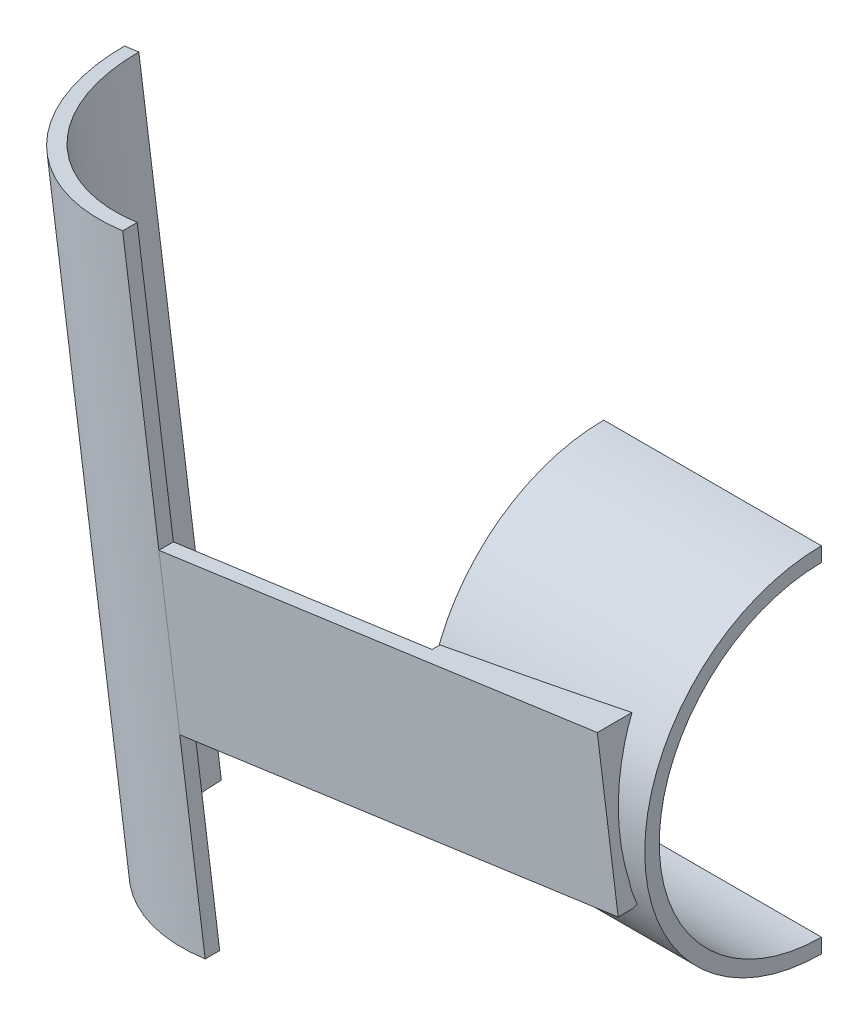
ISO-10303-21;
HEADER;
FILE_DESCRIPTION(('STEP AP214'),'2;1');
FILE_NAME('part.step','',(''),(''),'','','');
FILE_SCHEMA(('AUTOMOTIVE_DESIGN { 1 0 10303 214 1 1 1 1 }'));
ENDSEC;
DATA;
#1=APPLICATION_CONTEXT('core data for automotive mechanical design processes');
#2=APPLICATION_PROTOCOL_DEFINITION('international standard','automotive_design',2000,#1);
#3=PRODUCT_CONTEXT('',#1,'mechanical');
#4=PRODUCT('Part','Part','',(#3));
#5=PRODUCT_RELATED_PRODUCT_CATEGORY('part','',(#4));
#6=PRODUCT_DEFINITION_FORMATION('','',#4);
#7=PRODUCT_DEFINITION_CONTEXT('part definition',#1,'design');
#8=PRODUCT_DEFINITION('design','',#6,#7);
#9=PRODUCT_DEFINITION_SHAPE('','',#8);
#10=(LENGTH_UNIT() NAMED_UNIT(*) SI_UNIT(.MILLI.,.METRE.));
#11=(NAMED_UNIT(*) PLANE_ANGLE_UNIT() SI_UNIT($,.RADIAN.));
#12=(NAMED_UNIT(*) SI_UNIT($,.STERADIAN.) SOLID_ANGLE_UNIT());
#13=UNCERTAINTY_MEASURE_WITH_UNIT(LENGTH_MEASURE(1.E-05),#10,'distance_accuracy_value','');
#14=(GEOMETRIC_REPRESENTATION_CONTEXT(3) GLOBAL_UNCERTAINTY_ASSIGNED_CONTEXT((#13)) GLOBAL_UNIT_ASSIGNED_CONTEXT((#10,
#11,#12)) REPRESENTATION_CONTEXT('',''));
#15=CARTESIAN_POINT('',(0.,0.,0.));
#16=DIRECTION('',(0.,0.,1.));
#17=DIRECTION('',(1.,0.,0.));
#18=AXIS2_PLACEMENT_3D('',#15,#16,#17);
#19=CARTESIAN_POINT('',(485.481917252767,857.898759870621,0.));
#20=DIRECTION('',(-1.,0.,0.));
#21=DIRECTION('',(0.,0.,1.));
#22=AXIS2_PLACEMENT_3D('',#19,#20,#21);
#23=CYLINDRICAL_SURFACE('',#22,24.35);
#24=CARTESIAN_POINT('',(456.832927260746,857.898759870621,0.));
#25=DIRECTION('',(0.990343871933616,0.138632663263508,0.));
#26=DIRECTION('',(-0.138632663263508,0.990343871933616,0.));
#27=AXIS2_PLACEMENT_3D('',#24,#25,#26);
#28=ELLIPSE('',#27,24.5874192692861,24.35);
#29=CARTESIAN_POINT('',(455.585980190012,866.80651913209,22.662178292029));
#30=VERTEX_POINT('',#29);
#31=CARTESIAN_POINT('',(456.080910168967,863.270910278046,23.7500000000001));
#32=VERTEX_POINT('',#31);
#33=EDGE_CURVE('E186',#30,#32,#28,.T.);
#34=ORIENTED_EDGE('',*,*,#33,.F.);
#35=CARTESIAN_POINT('',(391.952024168503,857.898759870621,0.));
#36=DIRECTION('',(-0.138632663263508,0.990343871933616,0.));
#37=DIRECTION('',(-0.990343871933616,-0.138632663263508,0.));
#38=AXIS2_PLACEMENT_3D('',#35,#36,#37);
#39=ELLIPSE('',#38,175.644032414759,24.35);
#40=CARTESIAN_POINT('',(480.344576988352,870.272335713678,20.9718172997984));
#41=VERTEX_POINT('',#40);
#42=EDGE_CURVE('E205',#30,#41,#39,.T.);
#43=ORIENTED_EDGE('',*,*,#42,.T.);
#44=CARTESIAN_POINT('',(482.076684210732,857.898759870621,0.));
#45=DIRECTION('',(-0.990343871933616,-0.138632663263508,0.));
#46=DIRECTION('',(-0.138632663263508,0.990343871933616,0.));
#47=AXIS2_PLACEMENT_3D('',#44,#45,#46);
#48=ELLIPSE('',#47,24.5874192692861,24.35);
#49=CARTESIAN_POINT('',(482.828701302511,852.526609463196,23.7500000000001));
#50=VERTEX_POINT('',#49);
#51=EDGE_CURVE('E346',#50,#41,#48,.T.);
#52=ORIENTED_EDGE('',*,*,#51,.F.);
#53=DIRECTION('',(-1.,0.,0.));
#54=VECTOR('',#53,1.);
#55=CARTESIAN_POINT('',(485.481917252767,852.526609463196,23.7500000000001));
#56=LINE('',#55,#54);
#57=CARTESIAN_POINT('',(455.481917252767,852.526609463196,23.7500000000001));
#58=VERTEX_POINT('',#57);
#59=EDGE_CURVE('E53',#58,#50,#56,.F.);
#60=ORIENTED_EDGE('',*,*,#59,.F.);
#61=CARTESIAN_POINT('',(455.481917252767,857.898759870621,0.));
#62=DIRECTION('',(1.,0.,0.));
#63=DIRECTION('',(0.,0.,-1.));
#64=AXIS2_PLACEMENT_3D('',#61,#62,#63);
#65=CIRCLE('',#64,24.35);
#66=CARTESIAN_POINT('',(455.481917252767,833.548759870621,0.));
#67=VERTEX_POINT('',#66);
#68=EDGE_CURVE('E328',#58,#67,#65,.T.);
#69=ORIENTED_EDGE('',*,*,#68,.T.);
#70=DIRECTION('',(-1.,0.,0.));
#71=VECTOR('',#70,1.);
#72=CARTESIAN_POINT('',(485.481917252767,833.548759870621,0.));
#73=LINE('',#72,#71);
#74=CARTESIAN_POINT('',(485.481917252767,833.548759870621,0.));
#75=VERTEX_POINT('',#74);
#76=EDGE_CURVE('E314',#67,#75,#73,.F.);
#77=ORIENTED_EDGE('',*,*,#76,.T.);
#78=CARTESIAN_POINT('',(485.481917252767,857.898759870621,0.));
#79=DIRECTION('',(1.,0.,0.));
#80=DIRECTION('',(0.,0.,-1.));
#81=AXIS2_PLACEMENT_3D('',#78,#79,#80);
#82=CIRCLE('',#81,24.35);
#83=CARTESIAN_POINT('',(485.481917252767,882.248759870621,0.));
#84=VERTEX_POINT('',#83);
#85=EDGE_CURVE('E332',#84,#75,#82,.T.);
#86=ORIENTED_EDGE('',*,*,#85,.F.);
#87=DIRECTION('',(-1.,0.,0.));
#88=VECTOR('',#87,1.);
#89=CARTESIAN_POINT('',(485.481917252767,882.248759870621,0.));
#90=LINE('',#89,#88);
#91=CARTESIAN_POINT('',(455.481917252767,882.248759870621,0.));
#92=VERTEX_POINT('',#91);
#93=EDGE_CURVE('E319',#84,#92,#90,.T.);
#94=ORIENTED_EDGE('',*,*,#93,.T.);
#95=CARTESIAN_POINT('',(455.481917252767,863.270910278046,23.7500000000001));
#96=VERTEX_POINT('',#95);
#97=EDGE_CURVE('E337',#92,#96,#65,.T.);
#98=ORIENTED_EDGE('',*,*,#97,.T.);
#99=DIRECTION('',(-1.,0.,0.));
#100=VECTOR('',#99,1.);
#101=CARTESIAN_POINT('',(485.481917252767,863.270910278046,23.7500000000001));
#102=LINE('',#101,#100);
#103=EDGE_CURVE('E11',#32,#96,#102,.T.);
#104=ORIENTED_EDGE('',*,*,#103,.F.);
#105=EDGE_LOOP('',(#34,#43,#52,#60,#69,#77,#86,#94,#98,#104));
#106=FACE_BOUND('',#105,.T.);
#107=ADVANCED_FACE('F45',(#106),#23,.T.);
#108=CARTESIAN_POINT('',(480.344576988352,870.272335713678,23.7500000000001));
#109=DIRECTION('',(0.,0.,1.));
#110=DIRECTION('',(1.,0.,0.));
#111=AXIS2_PLACEMENT_3D('',#108,#109,#110);
#112=PLANE('',#111);
#113=DIRECTION('',(-0.138632663263508,0.990343871933616,0.));
#114=VECTOR('',#113,1.);
#115=CARTESIAN_POINT('',(480.344576988352,870.272335713678,23.7500000000001));
#116=LINE('',#115,#114);
#117=CARTESIAN_POINT('',(482.879640191024,852.162719634542,23.7500000000001));
#118=VERTEX_POINT('',#117);
#119=EDGE_CURVE('E65',#118,#50,#116,.T.);
#120=ORIENTED_EDGE('',*,*,#119,.F.);
#121=DIRECTION('',(0.990343871933616,0.138632663263508,0.));
#122=VECTOR('',#121,1.);
#123=CARTESIAN_POINT('',(458.121043392683,848.696903052954,23.7500000000001));
#124=LINE('',#123,#122);
#125=CARTESIAN_POINT('',(458.121043392683,848.696903052954,23.7500000000001));
#126=VERTEX_POINT('',#125);
#127=EDGE_CURVE('E60',#118,#126,#124,.F.);
#128=ORIENTED_EDGE('',*,*,#127,.T.);
#129=DIRECTION('',(-0.138632663263508,0.990343871933616,0.));
#130=VECTOR('',#129,1.);
#131=CARTESIAN_POINT('',(455.585980190012,866.80651913209,23.7500000000001));
#132=LINE('',#131,#130);
#133=CARTESIAN_POINT('',(458.466105689158,846.231897168306,23.7500000000001));
#134=VERTEX_POINT('',#133);
#135=EDGE_CURVE('E178',#134,#126,#132,.T.);
#136=ORIENTED_EDGE('',*,*,#135,.F.);
#137=DIRECTION('',(-0.990343871933616,-0.138632663263512,0.));
#138=VECTOR('',#137,1.);
#139=CARTESIAN_POINT('',(483.224702487498,849.697713749893,23.7500000000001));
#140=LINE('',#139,#138);
#141=CARTESIAN_POINT('',(422.813726299548,841.241121290819,23.7500000000001));
#142=VERTEX_POINT('',#141);
#143=EDGE_CURVE('E165',#134,#142,#140,.T.);
#144=ORIENTED_EDGE('',*,*,#143,.T.);
#145=DIRECTION('',(-0.138632663263508,0.990343871933616,0.));
#146=VECTOR('',#145,1.);
#147=CARTESIAN_POINT('',(419.933600800401,861.815743254604,23.7500000000001));
#148=LINE('',#147,#146);
#149=CARTESIAN_POINT('',(419.933600800401,861.815743254604,23.7500000000001));
#150=VERTEX_POINT('',#149);
#151=EDGE_CURVE('E271',#142,#150,#148,.T.);
#152=ORIENTED_EDGE('',*,*,#151,.T.);
#153=DIRECTION('',(-0.990343871933616,-0.138632663263512,0.));
#154=VECTOR('',#153,1.);
#155=CARTESIAN_POINT('',(480.344576988352,870.272335713678,23.7500000000001));
#156=LINE('',#155,#154);
#157=CARTESIAN_POINT('',(455.585980190012,866.80651913209,23.7500000000001));
#158=VERTEX_POINT('',#157);
#159=EDGE_CURVE('E299',#158,#150,#156,.T.);
#160=ORIENTED_EDGE('',*,*,#159,.F.);
#161=EDGE_CURVE('E188',#32,#158,#132,.T.);
#162=ORIENTED_EDGE('',*,*,#161,.F.);
#163=ORIENTED_EDGE('',*,*,#103,.T.);
#164=DIRECTION('',(0.,-1.,0.));
#165=VECTOR('',#164,1.);
#166=CARTESIAN_POINT('',(455.481917252767,857.898759870621,23.7500000000001));
#167=LINE('',#166,#165);
#168=EDGE_CURVE('E302',#96,#58,#167,.T.);
#169=ORIENTED_EDGE('',*,*,#168,.T.);
#170=ORIENTED_EDGE('',*,*,#59,.T.);
#171=EDGE_LOOP('',(#120,#128,#136,#144,#152,#160,#162,#163,#169,#170));
#172=FACE_BOUND('',#171,.T.);
#173=ADVANCED_FACE('F179',(#172),#112,.F.);
#174=CARTESIAN_POINT('',(455.481917252767,857.898759870621,0.));
#175=DIRECTION('',(1.,0.,0.));
#176=DIRECTION('',(0.,0.,-1.));
#177=AXIS2_PLACEMENT_3D('',#174,#175,#176);
#178=PLANE('',#177);
#179=ORIENTED_EDGE('',*,*,#168,.F.);
#180=ORIENTED_EDGE('',*,*,#97,.F.);
#181=DIRECTION('',(0.,-1.,0.));
#182=VECTOR('',#181,1.);
#183=CARTESIAN_POINT('',(455.481917252767,857.898759870621,0.));
#184=LINE('',#183,#182);
#185=CARTESIAN_POINT('',(455.481917252767,880.248759870621,0.));
#186=VERTEX_POINT('',#185);
#187=EDGE_CURVE('E311',#92,#186,#184,.T.);
#188=ORIENTED_EDGE('',*,*,#187,.T.);
#189=CARTESIAN_POINT('',(455.481917252767,857.898759870621,0.));
#190=DIRECTION('',(1.,0.,0.));
#191=DIRECTION('',(0.,0.,-1.));
#192=AXIS2_PLACEMENT_3D('',#189,#190,#191);
#193=CIRCLE('',#192,22.35);
#194=CARTESIAN_POINT('',(455.481917252767,835.548759870621,0.));
#195=VERTEX_POINT('',#194);
#196=EDGE_CURVE('E323',#186,#195,#193,.T.);
#197=ORIENTED_EDGE('',*,*,#196,.T.);
#198=EDGE_CURVE('E306',#195,#67,#184,.T.);
#199=ORIENTED_EDGE('',*,*,#198,.T.);
#200=ORIENTED_EDGE('',*,*,#68,.F.);
#201=EDGE_LOOP('',(#179,#180,#188,#197,#199,#200));
#202=FACE_BOUND('',#201,.T.);
#203=ADVANCED_FACE('F356',(#202),#178,.F.);
#204=CARTESIAN_POINT('',(485.481917252767,857.898759870621,0.));
#205=DIRECTION('',(1.,0.,0.));
#206=DIRECTION('',(0.,0.,-1.));
#207=AXIS2_PLACEMENT_3D('',#204,#205,#206);
#208=PLANE('',#207);
#209=DIRECTION('',(0.,-1.,0.));
#210=VECTOR('',#209,1.);
#211=CARTESIAN_POINT('',(485.481917252767,857.898759870621,0.));
#212=LINE('',#211,#210);
#213=CARTESIAN_POINT('',(485.481917252767,880.248759870621,0.));
#214=VERTEX_POINT('',#213);
#215=EDGE_CURVE('E315',#84,#214,#212,.T.);
#216=ORIENTED_EDGE('',*,*,#215,.F.);
#217=ORIENTED_EDGE('',*,*,#85,.T.);
#218=CARTESIAN_POINT('',(485.481917252767,835.548759870621,0.));
#219=VERTEX_POINT('',#218);
#220=EDGE_CURVE('E310',#219,#75,#212,.T.);
#221=ORIENTED_EDGE('',*,*,#220,.F.);
#222=CARTESIAN_POINT('',(485.481917252767,857.898759870621,0.));
#223=DIRECTION('',(1.,0.,0.));
#224=DIRECTION('',(0.,0.,-1.));
#225=AXIS2_PLACEMENT_3D('',#222,#223,#224);
#226=CIRCLE('',#225,22.35);
#227=EDGE_CURVE('E324',#214,#219,#226,.T.);
#228=ORIENTED_EDGE('',*,*,#227,.F.);
#229=EDGE_LOOP('',(#216,#217,#221,#228));
#230=FACE_BOUND('',#229,.T.);
#231=ADVANCED_FACE('F416',(#230),#208,.T.);
#232=CARTESIAN_POINT('',(485.481917252767,857.898759870621,0.));
#233=DIRECTION('',(-1.,0.,0.));
#234=DIRECTION('',(0.,0.,1.));
#235=AXIS2_PLACEMENT_3D('',#232,#233,#234);
#236=CYLINDRICAL_SURFACE('',#235,22.35);
#237=DIRECTION('',(-1.,0.,0.));
#238=VECTOR('',#237,1.);
#239=CARTESIAN_POINT('',(485.481917252767,880.248759870621,0.));
#240=LINE('',#239,#238);
#241=EDGE_CURVE('E343',#214,#186,#240,.T.);
#242=ORIENTED_EDGE('',*,*,#241,.F.);
#243=ORIENTED_EDGE('',*,*,#227,.T.);
#244=DIRECTION('',(-1.,0.,0.));
#245=VECTOR('',#244,1.);
#246=CARTESIAN_POINT('',(485.481917252767,835.548759870621,0.));
#247=LINE('',#246,#245);
#248=EDGE_CURVE('E336',#195,#219,#247,.F.);
#249=ORIENTED_EDGE('',*,*,#248,.F.);
#250=ORIENTED_EDGE('',*,*,#196,.F.);
#251=EDGE_LOOP('',(#242,#243,#249,#250));
#252=FACE_BOUND('',#251,.T.);
#253=ADVANCED_FACE('F409',(#252),#236,.F.);
#254=CARTESIAN_POINT('',(0.,0.,0.));
#255=DIRECTION('',(0.,0.,1.));
#256=DIRECTION('',(1.,0.,0.));
#257=AXIS2_PLACEMENT_3D('',#254,#255,#256);
#258=PLANE('',#257);
#259=ORIENTED_EDGE('',*,*,#198,.F.);
#260=ORIENTED_EDGE('',*,*,#248,.T.);
#261=ORIENTED_EDGE('',*,*,#220,.T.);
#262=ORIENTED_EDGE('',*,*,#76,.F.);
#263=EDGE_LOOP('',(#259,#260,#261,#262));
#264=FACE_BOUND('',#263,.T.);
#265=ADVANCED_FACE('F413',(#264),#258,.F.);
#266=ORIENTED_EDGE('',*,*,#215,.T.);
#267=ORIENTED_EDGE('',*,*,#241,.T.);
#268=ORIENTED_EDGE('',*,*,#187,.F.);
#269=ORIENTED_EDGE('',*,*,#93,.F.);
#270=EDGE_LOOP('',(#266,#267,#268,#269));
#271=FACE_BOUND('',#270,.T.);
#272=ADVANCED_FACE('F417',(#271),#258,.F.);
#273=CARTESIAN_POINT('',(480.344576988352,870.272335713678,23.7500000000001));
#274=DIRECTION('',(0.138632663263512,-0.990343871933616,0.));
#275=DIRECTION('',(0.990343871933616,0.138632663263512,0.));
#276=AXIS2_PLACEMENT_3D('',#273,#274,#275);
#277=PLANE('',#276);
#278=DIRECTION('',(0.,0.,1.));
#279=VECTOR('',#278,1.);
#280=CARTESIAN_POINT('',(480.344576988352,870.272335713678,23.7500000000001));
#281=LINE('',#280,#279);
#282=CARTESIAN_POINT('',(480.344576988352,870.272335713678,25.7500000000001));
#283=VERTEX_POINT('',#282);
#284=EDGE_CURVE('E274',#41,#283,#281,.T.);
#285=ORIENTED_EDGE('',*,*,#284,.F.);
#286=ORIENTED_EDGE('',*,*,#42,.F.);
#287=DIRECTION('',(0.,0.,1.));
#288=VECTOR('',#287,1.);
#289=CARTESIAN_POINT('',(455.585980190012,866.80651913209,25.7500000000001));
#290=LINE('',#289,#288);
#291=EDGE_CURVE('E201',#30,#158,#290,.T.);
#292=ORIENTED_EDGE('',*,*,#291,.T.);
#293=ORIENTED_EDGE('',*,*,#159,.T.);
#294=DIRECTION('',(0.,0.,1.));
#295=VECTOR('',#294,1.);
#296=CARTESIAN_POINT('',(419.933600800401,861.815743254604,23.7500000000001));
#297=LINE('',#296,#295);
#298=CARTESIAN_POINT('',(419.933600800401,861.815743254604,25.7500000000001));
#299=VERTEX_POINT('',#298);
#300=EDGE_CURVE('E284',#150,#299,#297,.T.);
#301=ORIENTED_EDGE('',*,*,#300,.T.);
#302=DIRECTION('',(-0.990343871933616,-0.138632663263512,0.));
#303=VECTOR('',#302,1.);
#304=CARTESIAN_POINT('',(480.344576988352,870.272335713678,25.7500000000001));
#305=LINE('',#304,#303);
#306=EDGE_CURVE('E296',#283,#299,#305,.T.);
#307=ORIENTED_EDGE('',*,*,#306,.F.);
#308=EDGE_LOOP('',(#285,#286,#292,#293,#301,#307));
#309=FACE_BOUND('',#308,.T.);
#310=ADVANCED_FACE('F397',(#309),#277,.F.);
#311=CARTESIAN_POINT('',(480.344576988352,870.272335713678,25.7500000000001));
#312=DIRECTION('',(0.,0.,-1.));
#313=DIRECTION('',(-1.,0.,0.));
#314=AXIS2_PLACEMENT_3D('',#311,#312,#313);
#315=PLANE('',#314);
#316=ORIENTED_EDGE('',*,*,#306,.T.);
#317=DIRECTION('',(0.138632663263508,-0.990343871933616,0.));
#318=VECTOR('',#317,1.);
#319=CARTESIAN_POINT('',(419.933600800401,861.815743254604,25.7500000000001));
#320=LINE('',#319,#318);
#321=CARTESIAN_POINT('',(422.813726299548,841.241121290819,25.7500000000001));
#322=VERTEX_POINT('',#321);
#323=EDGE_CURVE('E288',#299,#322,#320,.T.);
#324=ORIENTED_EDGE('',*,*,#323,.T.);
#325=DIRECTION('',(-0.990343871933616,-0.138632663263512,0.));
#326=VECTOR('',#325,1.);
#327=CARTESIAN_POINT('',(483.224702487498,849.697713749893,25.7500000000001));
#328=LINE('',#327,#326);
#329=CARTESIAN_POINT('',(483.224702487498,849.697713749893,25.7500000000001));
#330=VERTEX_POINT('',#329);
#331=EDGE_CURVE('E196',#330,#322,#328,.T.);
#332=ORIENTED_EDGE('',*,*,#331,.F.);
#333=DIRECTION('',(0.138632663263508,-0.990343871933616,0.));
#334=VECTOR('',#333,1.);
#335=CARTESIAN_POINT('',(480.344576988352,870.272335713678,25.7500000000001));
#336=LINE('',#335,#334);
#337=EDGE_CURVE('E277',#283,#330,#336,.T.);
#338=ORIENTED_EDGE('',*,*,#337,.F.);
#339=EDGE_LOOP('',(#316,#324,#332,#338));
#340=FACE_BOUND('',#339,.T.);
#341=ADVANCED_FACE('F392',(#340),#315,.F.);
#342=CARTESIAN_POINT('',(483.224702487498,849.697713749893,23.7500000000001));
#343=DIRECTION('',(-0.138632663263512,0.990343871933616,0.));
#344=DIRECTION('',(-0.990343871933616,-0.138632663263512,0.));
#345=AXIS2_PLACEMENT_3D('',#342,#343,#344);
#346=PLANE('',#345);
#347=ORIENTED_EDGE('',*,*,#331,.T.);
#348=DIRECTION('',(0.,0.,-1.));
#349=VECTOR('',#348,1.);
#350=CARTESIAN_POINT('',(422.813726299548,841.241121290819,23.7500000000001));
#351=LINE('',#350,#349);
#352=EDGE_CURVE('E172',#322,#142,#351,.T.);
#353=ORIENTED_EDGE('',*,*,#352,.T.);
#354=ORIENTED_EDGE('',*,*,#143,.F.);
#355=CARTESIAN_POINT('',(483.224702487498,849.697713749893,23.7500000000001));
#356=VERTEX_POINT('',#355);
#357=EDGE_CURVE('E169',#356,#134,#140,.T.);
#358=ORIENTED_EDGE('',*,*,#357,.F.);
#359=DIRECTION('',(0.,0.,-1.));
#360=VECTOR('',#359,1.);
#361=CARTESIAN_POINT('',(483.224702487498,849.697713749893,23.7500000000001));
#362=LINE('',#361,#360);
#363=EDGE_CURVE('E176',#330,#356,#362,.T.);
#364=ORIENTED_EDGE('',*,*,#363,.F.);
#365=EDGE_LOOP('',(#347,#353,#354,#358,#364));
#366=FACE_BOUND('',#365,.T.);
#367=ADVANCED_FACE('F166',(#366),#346,.F.);
#368=CARTESIAN_POINT('',(590.59600467061,82.6742097978695,0.));
#369=DIRECTION('',(-0.990343871933616,-0.138632663263508,0.));
#370=DIRECTION('',(0.138632663263508,-0.990343871933616,0.));
#371=AXIS2_PLACEMENT_3D('',#368,#369,#370);
#372=PLANE('',#371);
#373=ORIENTED_EDGE('',*,*,#51,.T.);
#374=ORIENTED_EDGE('',*,*,#284,.T.);
#375=ORIENTED_EDGE('',*,*,#337,.T.);
#376=ORIENTED_EDGE('',*,*,#363,.T.);
#377=DIRECTION('',(-0.0418365908483556,0.298866157468764,-0.953377532557823));
#378=VECTOR('',#377,1.);
#379=CARTESIAN_POINT('',(483.196497642607,849.899199421739,23.1072644213165));
#380=LINE('',#379,#378);
#381=CARTESIAN_POINT('',(483.196497642607,849.899199421739,23.1072644213165));
#382=VERTEX_POINT('',#381);
#383=EDGE_CURVE('E194',#356,#382,#380,.T.);
#384=ORIENTED_EDGE('',*,*,#383,.T.);
#385=CARTESIAN_POINT('',(482.141796007773,857.433623677809,0.438539615017938));
#386=DIRECTION('',(-0.990343871933616,-0.138632663263508,0.));
#387=DIRECTION('',(-0.138632663263508,0.990343871933616,0.));
#388=AXIS2_PLACEMENT_3D('',#385,#386,#387);
#389=CIRCLE('',#388,23.9113159142837);
#390=EDGE_CURVE('E211',#382,#118,#389,.T.);
#391=ORIENTED_EDGE('',*,*,#390,.T.);
#392=ORIENTED_EDGE('',*,*,#119,.T.);
#393=EDGE_LOOP('',(#373,#374,#375,#376,#384,#391,#392));
#394=FACE_BOUND('',#393,.T.);
#395=ADVANCED_FACE('F440',(#394),#372,.F.);
#396=CARTESIAN_POINT('',(414.924769966481,897.597101018005,30.));
#397=DIRECTION('',(0.990343871933616,0.138632663263512,0.));
#398=DIRECTION('',(-0.138632663263512,0.990343871933616,0.));
#399=AXIS2_PLACEMENT_3D('',#396,#397,#398);
#400=PLANE('',#399);
#401=ORIENTED_EDGE('',*,*,#352,.F.);
#402=DIRECTION('',(0.138632663263512,-0.990343871933616,0.));
#403=VECTOR('',#402,1.);
#404=CARTESIAN_POINT('',(414.946253565643,897.443629604589,25.7500000000001));
#405=LINE('',#404,#403);
#406=CARTESIAN_POINT('',(426.314131953251,816.235432106032,25.7500000000001));
#407=VERTEX_POINT('',#406);
#408=EDGE_CURVE('E242',#407,#322,#405,.F.);
#409=ORIENTED_EDGE('',*,*,#408,.F.);
#410=DIRECTION('',(0.,0.,-1.));
#411=VECTOR('',#410,1.);
#412=CARTESIAN_POINT('',(426.314131953251,816.235432106032,30.));
#413=LINE('',#412,#411);
#414=CARTESIAN_POINT('',(426.314131953251,816.235432106032,23.7500000000001));
#415=VERTEX_POINT('',#414);
#416=EDGE_CURVE('E234',#407,#415,#413,.T.);
#417=ORIENTED_EDGE('',*,*,#416,.T.);
#418=DIRECTION('',(0.138632663263512,-0.990343871933616,0.));
#419=VECTOR('',#418,1.);
#420=CARTESIAN_POINT('',(414.946253565643,897.443629604589,23.7500000000001));
#421=LINE('',#420,#419);
#422=EDGE_CURVE('E263',#415,#142,#421,.F.);
#423=ORIENTED_EDGE('',*,*,#422,.T.);
#424=EDGE_LOOP('',(#401,#409,#417,#423));
#425=FACE_BOUND('',#424,.T.);
#426=ADVANCED_FACE('F443',(#425),#400,.T.);
#427=ORIENTED_EDGE('',*,*,#300,.F.);
#428=CARTESIAN_POINT('',(414.946253565643,897.443629604589,23.7500000000001));
#429=VERTEX_POINT('',#428);
#430=EDGE_CURVE('E259',#150,#429,#421,.F.);
#431=ORIENTED_EDGE('',*,*,#430,.T.);
#432=DIRECTION('',(0.,0.,1.));
#433=VECTOR('',#432,1.);
#434=CARTESIAN_POINT('',(414.946253565643,897.443629604589,0.));
#435=LINE('',#434,#433);
#436=CARTESIAN_POINT('',(414.946253565643,897.443629604589,25.7500000000001));
#437=VERTEX_POINT('',#436);
#438=EDGE_CURVE('E237',#429,#437,#435,.T.);
#439=ORIENTED_EDGE('',*,*,#438,.T.);
#440=EDGE_CURVE('E241',#299,#437,#405,.F.);
#441=ORIENTED_EDGE('',*,*,#440,.F.);
#442=EDGE_LOOP('',(#427,#431,#439,#441));
#443=FACE_BOUND('',#442,.T.);
#444=ADVANCED_FACE('F373',(#443),#400,.T.);
#445=CARTESIAN_POINT('',(414.946253565643,897.443629604589,0.));
#446=DIRECTION('',(0.138632663263512,-0.990343871933616,0.));
#447=DIRECTION('',(0.990343871933616,0.138632663263512,0.));
#448=AXIS2_PLACEMENT_3D('',#445,#446,#447);
#449=CYLINDRICAL_SURFACE('',#448,25.7500000000001);
#450=DIRECTION('',(0.138632663263512,-0.990343871933616,0.));
#451=VECTOR('',#450,1.);
#452=CARTESIAN_POINT('',(389.444898863352,893.873838525553,0.));
#453=LINE('',#452,#451);
#454=CARTESIAN_POINT('',(400.81277725096,812.665641026997,0.));
#455=VERTEX_POINT('',#454);
#456=CARTESIAN_POINT('',(389.444898863352,893.873838525553,0.));
#457=VERTEX_POINT('',#456);
#458=EDGE_CURVE('E231',#455,#457,#453,.F.);
#459=ORIENTED_EDGE('',*,*,#458,.F.);
#460=CARTESIAN_POINT('',(426.314131953251,816.235432106032,0.));
#461=DIRECTION('',(0.138632663263512,-0.990343871933616,0.));
#462=DIRECTION('',(0.990343871933616,0.138632663263512,0.));
#463=AXIS2_PLACEMENT_3D('',#460,#461,#462);
#464=CIRCLE('',#463,25.7500000000001);
#465=EDGE_CURVE('E251',#407,#455,#464,.T.);
#466=ORIENTED_EDGE('',*,*,#465,.F.);
#467=ORIENTED_EDGE('',*,*,#408,.T.);
#468=ORIENTED_EDGE('',*,*,#323,.F.);
#469=ORIENTED_EDGE('',*,*,#440,.T.);
#470=CARTESIAN_POINT('',(414.946253565643,897.443629604589,0.));
#471=DIRECTION('',(0.138632663263512,-0.990343871933616,0.));
#472=DIRECTION('',(0.990343871933616,0.138632663263512,0.));
#473=AXIS2_PLACEMENT_3D('',#470,#471,#472);
#474=CIRCLE('',#473,25.7500000000001);
#475=EDGE_CURVE('E255',#437,#457,#474,.T.);
#476=ORIENTED_EDGE('',*,*,#475,.T.);
#477=EDGE_LOOP('',(#459,#466,#467,#468,#469,#476));
#478=FACE_BOUND('',#477,.T.);
#479=ADVANCED_FACE('F368',(#478),#449,.T.);
#480=CARTESIAN_POINT('',(414.946253565643,897.443629604589,0.));
#481=DIRECTION('',(0.138632663263512,-0.990343871933616,0.));
#482=DIRECTION('',(0.990343871933616,0.138632663263512,0.));
#483=AXIS2_PLACEMENT_3D('',#480,#481,#482);
#484=PLANE('',#483);
#485=CARTESIAN_POINT('',(414.946253565643,897.443629604589,0.));
#486=DIRECTION('',(0.138632663263512,-0.990343871933616,0.));
#487=DIRECTION('',(0.990343871933616,0.138632663263512,0.));
#488=AXIS2_PLACEMENT_3D('',#485,#486,#487);
#489=CIRCLE('',#488,23.7500000000001);
#490=CARTESIAN_POINT('',(391.425586607219,894.15110385208,0.));
#491=VERTEX_POINT('',#490);
#492=EDGE_CURVE('E247',#429,#491,#489,.T.);
#493=ORIENTED_EDGE('',*,*,#492,.T.);
#494=DIRECTION('',(-0.990343871933616,-0.138632663263512,0.));
#495=VECTOR('',#494,1.);
#496=CARTESIAN_POINT('',(414.946253565643,897.443629604589,0.));
#497=LINE('',#496,#495);
#498=EDGE_CURVE('E227',#491,#457,#497,.T.);
#499=ORIENTED_EDGE('',*,*,#498,.T.);
#500=ORIENTED_EDGE('',*,*,#475,.F.);
#501=ORIENTED_EDGE('',*,*,#438,.F.);
#502=EDGE_LOOP('',(#493,#499,#500,#501));
#503=FACE_BOUND('',#502,.T.);
#504=ADVANCED_FACE('F377',(#503),#484,.F.);
#505=CARTESIAN_POINT('',(426.314131953251,816.235432106032,0.));
#506=DIRECTION('',(0.138632663263512,-0.990343871933616,0.));
#507=DIRECTION('',(0.990343871933616,0.138632663263512,0.));
#508=AXIS2_PLACEMENT_3D('',#505,#506,#507);
#509=PLANE('',#508);
#510=DIRECTION('',(-0.990343871933616,-0.138632663263512,0.));
#511=VECTOR('',#510,1.);
#512=CARTESIAN_POINT('',(426.314131953251,816.235432106032,0.));
#513=LINE('',#512,#511);
#514=CARTESIAN_POINT('',(402.793464994827,812.942906353524,0.));
#515=VERTEX_POINT('',#514);
#516=EDGE_CURVE('E185',#515,#455,#513,.T.);
#517=ORIENTED_EDGE('',*,*,#516,.F.);
#518=CARTESIAN_POINT('',(426.314131953251,816.235432106032,0.));
#519=DIRECTION('',(0.138632663263512,-0.990343871933616,0.));
#520=DIRECTION('',(0.990343871933616,0.138632663263512,0.));
#521=AXIS2_PLACEMENT_3D('',#518,#519,#520);
#522=CIRCLE('',#521,23.7500000000001);
#523=EDGE_CURVE('E246',#415,#515,#522,.T.);
#524=ORIENTED_EDGE('',*,*,#523,.F.);
#525=ORIENTED_EDGE('',*,*,#416,.F.);
#526=ORIENTED_EDGE('',*,*,#465,.T.);
#527=EDGE_LOOP('',(#517,#524,#525,#526));
#528=FACE_BOUND('',#527,.T.);
#529=ADVANCED_FACE('F387',(#528),#509,.T.);
#530=CARTESIAN_POINT('',(414.946253565643,897.443629604589,0.));
#531=DIRECTION('',(0.138632663263512,-0.990343871933616,0.));
#532=DIRECTION('',(0.990343871933616,0.138632663263512,0.));
#533=AXIS2_PLACEMENT_3D('',#530,#531,#532);
#534=CYLINDRICAL_SURFACE('',#533,23.7500000000001);
#535=ORIENTED_EDGE('',*,*,#523,.T.);
#536=DIRECTION('',(0.138632663263512,-0.990343871933616,0.));
#537=VECTOR('',#536,1.);
#538=CARTESIAN_POINT('',(391.425586607219,894.15110385208,0.));
#539=LINE('',#538,#537);
#540=EDGE_CURVE('E267',#515,#491,#539,.F.);
#541=ORIENTED_EDGE('',*,*,#540,.T.);
#542=ORIENTED_EDGE('',*,*,#492,.F.);
#543=ORIENTED_EDGE('',*,*,#430,.F.);
#544=ORIENTED_EDGE('',*,*,#151,.F.);
#545=ORIENTED_EDGE('',*,*,#422,.F.);
#546=EDGE_LOOP('',(#535,#541,#542,#543,#544,#545));
#547=FACE_BOUND('',#546,.T.);
#548=ADVANCED_FACE('F382',(#547),#534,.F.);
#549=CARTESIAN_POINT('',(0.,0.,0.));
#550=DIRECTION('',(0.,0.,1.));
#551=DIRECTION('',(1.,0.,0.));
#552=AXIS2_PLACEMENT_3D('',#549,#550,#551);
#553=PLANE('',#552);
#554=ORIENTED_EDGE('',*,*,#458,.T.);
#555=ORIENTED_EDGE('',*,*,#498,.F.);
#556=ORIENTED_EDGE('',*,*,#540,.F.);
#557=ORIENTED_EDGE('',*,*,#516,.T.);
#558=EDGE_LOOP('',(#554,#555,#556,#557));
#559=FACE_BOUND('',#558,.T.);
#560=ADVANCED_FACE('F379',(#559),#553,.F.);
#561=CARTESIAN_POINT('',(458.437900844266,846.433382840151,23.1072644213165));
#562=DIRECTION('',(0.132169266434083,-0.944171597007832,-0.301780185588711));
#563=DIRECTION('',(0.,0.304451085901685,-0.95252797139679));
#564=AXIS2_PLACEMENT_3D('',#561,#562,#563);
#565=PLANE('',#564);
#566=ORIENTED_EDGE('',*,*,#383,.F.);
#567=ORIENTED_EDGE('',*,*,#357,.T.);
#568=DIRECTION('',(-0.0418365908483556,0.298866157468764,-0.953377532557823));
#569=VECTOR('',#568,1.);
#570=CARTESIAN_POINT('',(458.437900844266,846.433382840151,23.1072644213165));
#571=LINE('',#570,#569);
#572=CARTESIAN_POINT('',(458.437900844266,846.433382840151,23.1072644213165));
#573=VERTEX_POINT('',#572);
#574=EDGE_CURVE('E192',#134,#573,#571,.T.);
#575=ORIENTED_EDGE('',*,*,#574,.T.);
#576=DIRECTION('',(0.990343871933616,0.138632663263508,0.));
#577=VECTOR('',#576,1.);
#578=CARTESIAN_POINT('',(458.437900844266,846.433382840151,23.1072644213165));
#579=LINE('',#578,#577);
#580=EDGE_CURVE('E200',#573,#382,#579,.T.);
#581=ORIENTED_EDGE('',*,*,#580,.T.);
#582=EDGE_LOOP('',(#566,#567,#575,#581));
#583=FACE_BOUND('',#582,.T.);
#584=ADVANCED_FACE('F191',(#583),#565,.T.);
#585=CARTESIAN_POINT('',(457.383199209432,853.967807096221,0.438539615017938));
#586=DIRECTION('',(0.990343871933616,0.138632663263508,0.));
#587=DIRECTION('',(-0.138632663263508,0.990343871933616,0.));
#588=AXIS2_PLACEMENT_3D('',#585,#586,#587);
#589=PLANE('',#588);
#590=ORIENTED_EDGE('',*,*,#574,.F.);
#591=ORIENTED_EDGE('',*,*,#135,.T.);
#592=CARTESIAN_POINT('',(457.383199209432,853.967807096221,0.438539615017938));
#593=DIRECTION('',(-0.990343871933616,-0.138632663263508,0.));
#594=DIRECTION('',(-0.138632663263508,0.990343871933616,0.));
#595=AXIS2_PLACEMENT_3D('',#592,#593,#594);
#596=CIRCLE('',#595,23.9113159142837);
#597=EDGE_CURVE('E198',#573,#126,#596,.T.);
#598=ORIENTED_EDGE('',*,*,#597,.F.);
#599=EDGE_LOOP('',(#590,#591,#598));
#600=FACE_BOUND('',#599,.T.);
#601=ADVANCED_FACE('F197',(#600),#589,.F.);
#602=CARTESIAN_POINT('',(457.383199209432,853.967807096221,0.438539615017938));
#603=DIRECTION('',(0.990343871933616,0.138632663263508,0.));
#604=DIRECTION('',(-0.138632663263508,0.990343871933616,0.));
#605=AXIS2_PLACEMENT_3D('',#602,#603,#604);
#606=CYLINDRICAL_SURFACE('',#605,23.9113159142837);
#607=ORIENTED_EDGE('',*,*,#127,.F.);
#608=ORIENTED_EDGE('',*,*,#390,.F.);
#609=ORIENTED_EDGE('',*,*,#580,.F.);
#610=ORIENTED_EDGE('',*,*,#597,.T.);
#611=EDGE_LOOP('',(#607,#608,#609,#610));
#612=FACE_BOUND('',#611,.T.);
#613=ADVANCED_FACE('F456',(#612),#606,.F.);
#614=ORIENTED_EDGE('',*,*,#291,.F.);
#615=ORIENTED_EDGE('',*,*,#33,.T.);
#616=ORIENTED_EDGE('',*,*,#161,.T.);
#617=EDGE_LOOP('',(#614,#615,#616));
#618=FACE_BOUND('',#617,.T.);
#619=ADVANCED_FACE('F459',(#618),#589,.F.);
#620=CLOSED_SHELL('',(#107,#173,#203,#231,#253,#265,#272,#310,#341,#367,#395,#426,#444,#479,
#504,#529,#548,#560,#584,#601,#613,#619));
#621=MANIFOLD_SOLID_BREP('B2',#620);
#622=ADVANCED_BREP_SHAPE_REPRESENTATION('',(#18,#621),#14);
#623=SHAPE_DEFINITION_REPRESENTATION(#9,#622);
ENDSEC;
END-ISO-10303-21;
